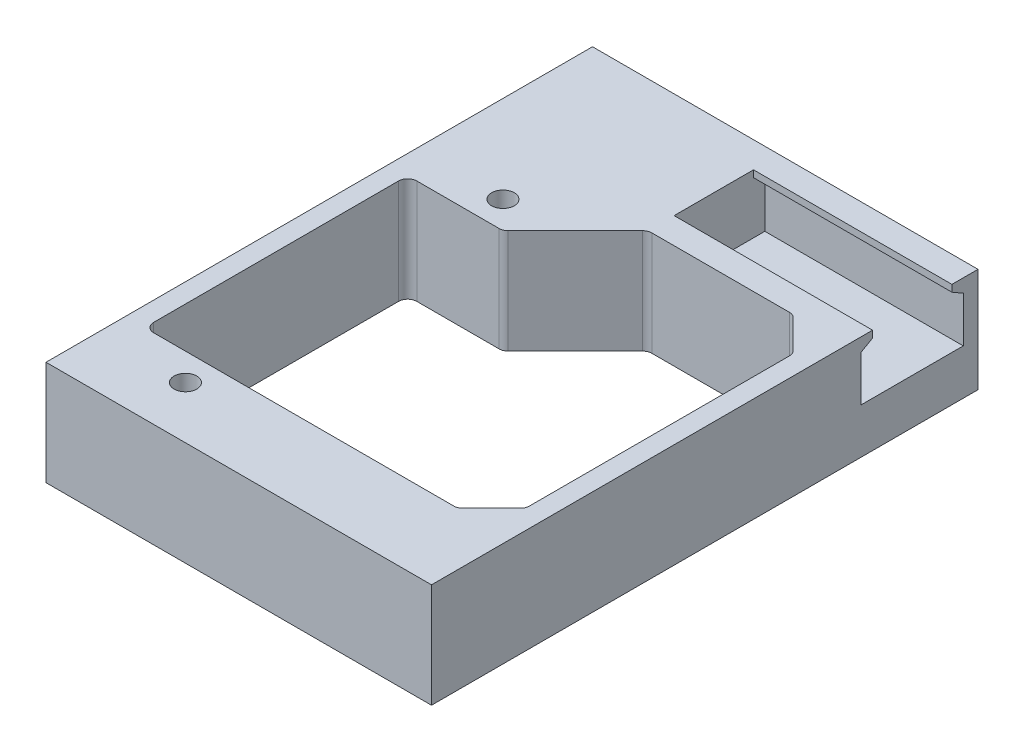
ISO-10303-21;
HEADER;
FILE_DESCRIPTION(('STEP AP214'),'2;1');
FILE_NAME('part.step','',(''),(''),'','','');
FILE_SCHEMA(('AUTOMOTIVE_DESIGN { 1 0 10303 214 1 1 1 1 }'));
ENDSEC;
DATA;
#1=APPLICATION_CONTEXT('core data for automotive mechanical design processes');
#2=APPLICATION_PROTOCOL_DEFINITION('international standard','automotive_design',2000,#1);
#3=PRODUCT_CONTEXT('',#1,'mechanical');
#4=PRODUCT('Part','Part','',(#3));
#5=PRODUCT_RELATED_PRODUCT_CATEGORY('part','',(#4));
#6=PRODUCT_DEFINITION_FORMATION('','',#4);
#7=PRODUCT_DEFINITION_CONTEXT('part definition',#1,'design');
#8=PRODUCT_DEFINITION('design','',#6,#7);
#9=PRODUCT_DEFINITION_SHAPE('','',#8);
#10=(LENGTH_UNIT() NAMED_UNIT(*) SI_UNIT(.MILLI.,.METRE.));
#11=(NAMED_UNIT(*) PLANE_ANGLE_UNIT() SI_UNIT($,.RADIAN.));
#12=(NAMED_UNIT(*) SI_UNIT($,.STERADIAN.) SOLID_ANGLE_UNIT());
#13=UNCERTAINTY_MEASURE_WITH_UNIT(LENGTH_MEASURE(1.E-05),#10,'distance_accuracy_value','');
#14=(GEOMETRIC_REPRESENTATION_CONTEXT(3) GLOBAL_UNCERTAINTY_ASSIGNED_CONTEXT((#13)) GLOBAL_UNIT_ASSIGNED_CONTEXT((#10,
#11,#12)) REPRESENTATION_CONTEXT('',''));
#15=CARTESIAN_POINT('',(0.,0.,0.));
#16=DIRECTION('',(0.,0.,1.));
#17=DIRECTION('',(1.,0.,0.));
#18=AXIS2_PLACEMENT_3D('',#15,#16,#17);
#19=CARTESIAN_POINT('',(12.3,-1.,8.5));
#20=DIRECTION('',(0.,-1.,0.));
#21=DIRECTION('',(1.,0.,0.));
#22=AXIS2_PLACEMENT_3D('',#19,#20,#21);
#23=PLANE('',#22);
#24=CARTESIAN_POINT('',(-14.,-1.,-54.3115384615385));
#25=DIRECTION('',(0.,1.,0.));
#26=DIRECTION('',(0.,0.,1.));
#27=AXIS2_PLACEMENT_3D('',#24,#25,#26);
#28=CIRCLE('',#27,1.);
#29=CARTESIAN_POINT('',(-14.,-1.,-53.3115384615385));
#30=VERTEX_POINT('',#29);
#31=EDGE_CURVE('E456',#30,#30,#28,.F.);
#32=ORIENTED_EDGE('',*,*,#31,.T.);
#33=EDGE_LOOP('',(#32));
#34=FACE_BOUND('',#33,.T.);
#35=CARTESIAN_POINT('',(-14.,-1.,-26.3115384615385));
#36=DIRECTION('',(0.,1.,0.));
#37=DIRECTION('',(0.,0.,1.));
#38=AXIS2_PLACEMENT_3D('',#35,#36,#37);
#39=CIRCLE('',#38,1.);
#40=CARTESIAN_POINT('',(-14.,-1.,-25.3115384615385));
#41=VERTEX_POINT('',#40);
#42=EDGE_CURVE('E502',#41,#41,#39,.F.);
#43=ORIENTED_EDGE('',*,*,#42,.T.);
#44=EDGE_LOOP('',(#43));
#45=FACE_BOUND('',#44,.T.);
#46=DIRECTION('',(-1.,0.,0.));
#47=VECTOR('',#46,1.);
#48=CARTESIAN_POINT('',(-21.7,-1.,-51.9115384615385));
#49=LINE('',#48,#47);
#50=CARTESIAN_POINT('',(-11.9313708498984,-1.,-51.9115384615385));
#51=VERTEX_POINT('',#50);
#52=CARTESIAN_POINT('',(-19.2,-1.,-51.9115384615385));
#53=VERTEX_POINT('',#52);
#54=EDGE_CURVE('E505',#51,#53,#49,.T.);
#55=ORIENTED_EDGE('',*,*,#54,.F.);
#56=CARTESIAN_POINT('',(-11.9313708498984,-1.,-52.7115384615385));
#57=DIRECTION('',(0.,-1.,0.));
#58=DIRECTION('',(1.,0.,0.));
#59=AXIS2_PLACEMENT_3D('',#56,#57,#58);
#60=CIRCLE('',#59,0.8);
#61=CARTESIAN_POINT('',(-11.3656854249492,-1.,-52.1458530365892));
#62=VERTEX_POINT('',#61);
#63=EDGE_CURVE('E403',#51,#62,#60,.F.);
#64=ORIENTED_EDGE('',*,*,#63,.T.);
#65=DIRECTION('',(-0.707106781186545,0.,0.70710678118655));
#66=VECTOR('',#65,1.);
#67=CARTESIAN_POINT('',(-29.8557692307693,-1.00000000000001,-33.655769230769));
#68=LINE('',#67,#66);
#69=CARTESIAN_POINT('',(-5.43431457505077,-1.,-58.0772238864877));
#70=VERTEX_POINT('',#69);
#71=EDGE_CURVE('E362',#62,#70,#68,.F.);
#72=ORIENTED_EDGE('',*,*,#71,.T.);
#73=CARTESIAN_POINT('',(-4.86862915010152,-1.,-57.5115384615385));
#74=DIRECTION('',(0.,-1.,0.));
#75=DIRECTION('',(1.,0.,0.));
#76=AXIS2_PLACEMENT_3D('',#73,#74,#75);
#77=CIRCLE('',#76,0.8);
#78=CARTESIAN_POINT('',(-4.86862915010152,-1.,-58.3115384615385));
#79=VERTEX_POINT('',#78);
#80=EDGE_CURVE('E13',#70,#79,#77,.T.);
#81=ORIENTED_EDGE('',*,*,#80,.T.);
#82=DIRECTION('',(-1.,0.,0.));
#83=VECTOR('',#82,1.);
#84=CARTESIAN_POINT('',(12.,-1.,-58.3115384615385));
#85=LINE('',#84,#83);
#86=CARTESIAN_POINT('',(7.26862915010156,-1.,-58.3115384615385));
#87=VERTEX_POINT('',#86);
#88=EDGE_CURVE('E448',#87,#79,#85,.T.);
#89=ORIENTED_EDGE('',*,*,#88,.F.);
#90=CARTESIAN_POINT('',(7.26862915010156,-1.,-57.5115384615385));
#91=DIRECTION('',(0.,-1.,0.));
#92=DIRECTION('',(1.,0.,0.));
#93=AXIS2_PLACEMENT_3D('',#90,#91,#92);
#94=CIRCLE('',#93,0.8);
#95=CARTESIAN_POINT('',(7.83431457505078,-1.,-58.0772238864877));
#96=VERTEX_POINT('',#95);
#97=EDGE_CURVE('E430',#87,#96,#94,.T.);
#98=ORIENTED_EDGE('',*,*,#97,.T.);
#99=DIRECTION('',(-0.707106781186544,0.,-0.707106781186551));
#100=VECTOR('',#99,1.);
#101=CARTESIAN_POINT('',(43.3557692307692,-0.999999999999996,-22.5557692307689));
#102=LINE('',#101,#100);
#103=CARTESIAN_POINT('',(10.3656854249492,-1.,-55.5458530365892));
#104=VERTEX_POINT('',#103);
#105=EDGE_CURVE('E359',#96,#104,#102,.F.);
#106=ORIENTED_EDGE('',*,*,#105,.T.);
#107=CARTESIAN_POINT('',(9.8,-1.,-54.98016761164));
#108=DIRECTION('',(0.,-1.,0.));
#109=DIRECTION('',(1.,0.,0.));
#110=AXIS2_PLACEMENT_3D('',#107,#108,#109);
#111=CIRCLE('',#110,0.8);
#112=CARTESIAN_POINT('',(10.6,-1.,-54.98016761164));
#113=VERTEX_POINT('',#112);
#114=EDGE_CURVE('E428',#104,#113,#111,.T.);
#115=ORIENTED_EDGE('',*,*,#114,.T.);
#116=DIRECTION('',(0.,0.,1.));
#117=VECTOR('',#116,1.);
#118=CARTESIAN_POINT('',(10.6,-1.,-28.7115384615385));
#119=LINE('',#118,#117);
#120=CARTESIAN_POINT('',(10.6,-1.,-32.042909311437));
#121=VERTEX_POINT('',#120);
#122=EDGE_CURVE('E477',#113,#121,#119,.T.);
#123=ORIENTED_EDGE('',*,*,#122,.T.);
#124=CARTESIAN_POINT('',(9.8,-1.,-32.042909311437));
#125=DIRECTION('',(0.,-1.,0.));
#126=DIRECTION('',(1.,0.,0.));
#127=AXIS2_PLACEMENT_3D('',#124,#125,#126);
#128=CIRCLE('',#127,0.8);
#129=CARTESIAN_POINT('',(10.3656854249492,-1.,-31.4772238864877));
#130=VERTEX_POINT('',#129);
#131=EDGE_CURVE('E422',#121,#130,#128,.T.);
#132=ORIENTED_EDGE('',*,*,#131,.T.);
#133=DIRECTION('',(0.707106781186543,0.,-0.707106781186552));
#134=VECTOR('',#133,1.);
#135=CARTESIAN_POINT('',(-8.65576923076926,-1.,-12.455769230769));
#136=LINE('',#135,#134);
#137=CARTESIAN_POINT('',(7.83431457505077,-1.,-28.9458530365892));
#138=VERTEX_POINT('',#137);
#139=EDGE_CURVE('E350',#130,#138,#136,.F.);
#140=ORIENTED_EDGE('',*,*,#139,.T.);
#141=CARTESIAN_POINT('',(7.26862915010153,-1.,-29.5115384615385));
#142=DIRECTION('',(0.,-1.,0.));
#143=DIRECTION('',(1.,0.,0.));
#144=AXIS2_PLACEMENT_3D('',#141,#142,#143);
#145=CIRCLE('',#144,0.8);
#146=CARTESIAN_POINT('',(7.26862915010153,-1.,-28.7115384615385));
#147=VERTEX_POINT('',#146);
#148=EDGE_CURVE('E420',#138,#147,#145,.T.);
#149=ORIENTED_EDGE('',*,*,#148,.T.);
#150=DIRECTION('',(1.,0.,0.));
#151=VECTOR('',#150,1.);
#152=CARTESIAN_POINT('',(-21.7,-1.,-28.7115384615385));
#153=LINE('',#152,#151);
#154=CARTESIAN_POINT('',(-19.2,-1.,-28.7115384615385));
#155=VERTEX_POINT('',#154);
#156=EDGE_CURVE('E309',#155,#147,#153,.T.);
#157=ORIENTED_EDGE('',*,*,#156,.F.);
#158=CARTESIAN_POINT('',(-19.2,-1.,-29.5115384615385));
#159=DIRECTION('',(0.,-1.,0.));
#160=DIRECTION('',(1.,0.,0.));
#161=AXIS2_PLACEMENT_3D('',#158,#159,#160);
#162=CIRCLE('',#161,0.8);
#163=CARTESIAN_POINT('',(-20.,-1.,-29.5115384615385));
#164=VERTEX_POINT('',#163);
#165=EDGE_CURVE('E416',#155,#164,#162,.T.);
#166=ORIENTED_EDGE('',*,*,#165,.T.);
#167=DIRECTION('',(0.,0.,1.));
#168=VECTOR('',#167,1.);
#169=CARTESIAN_POINT('',(-20.,-1.,0.));
#170=LINE('',#169,#168);
#171=CARTESIAN_POINT('',(-20.,-1.,-51.1115384615385));
#172=VERTEX_POINT('',#171);
#173=EDGE_CURVE('E452',#172,#164,#170,.T.);
#174=ORIENTED_EDGE('',*,*,#173,.F.);
#175=CARTESIAN_POINT('',(-19.2,-1.,-51.1115384615385));
#176=DIRECTION('',(0.,-1.,0.));
#177=DIRECTION('',(1.,0.,0.));
#178=AXIS2_PLACEMENT_3D('',#175,#176,#177);
#179=CIRCLE('',#178,0.8);
#180=EDGE_CURVE('E410',#172,#53,#179,.T.);
#181=ORIENTED_EDGE('',*,*,#180,.T.);
#182=EDGE_LOOP('',(#55,#64,#72,#81,#89,#98,#106,#115,#123,#132,#140,#149,#157,#166,#174,#181));
#183=FACE_BOUND('',#182,.T.);
#184=DIRECTION('',(0.,0.,-1.));
#185=VECTOR('',#184,1.);
#186=CARTESIAN_POINT('',(-21.7,-1.,8.5));
#187=LINE('',#186,#185);
#188=CARTESIAN_POINT('',(-21.7,-1.,-21.7115384615385));
#189=VERTEX_POINT('',#188);
#190=CARTESIAN_POINT('',(-21.7,-1.,-69.9115384615385));
#191=VERTEX_POINT('',#190);
#192=EDGE_CURVE('E314',#189,#191,#187,.T.);
#193=ORIENTED_EDGE('',*,*,#192,.F.);
#194=DIRECTION('',(-1.,0.,0.));
#195=VECTOR('',#194,1.);
#196=CARTESIAN_POINT('',(-21.7,-1.,-21.7115384615385));
#197=LINE('',#196,#195);
#198=CARTESIAN_POINT('',(12.3,-1.,-21.7115384615385));
#199=VERTEX_POINT('',#198);
#200=EDGE_CURVE('E299',#199,#189,#197,.T.);
#201=ORIENTED_EDGE('',*,*,#200,.F.);
#202=DIRECTION('',(0.,0.,-1.));
#203=VECTOR('',#202,1.);
#204=CARTESIAN_POINT('',(12.3,-1.,-21.7115384615385));
#205=LINE('',#204,#203);
#206=CARTESIAN_POINT('',(12.3,-1.,-60.6115384615385));
#207=VERTEX_POINT('',#206);
#208=EDGE_CURVE('E499',#199,#207,#205,.T.);
#209=ORIENTED_EDGE('',*,*,#208,.T.);
#210=DIRECTION('',(1.,0.,0.));
#211=VECTOR('',#210,1.);
#212=CARTESIAN_POINT('',(-5.20000000000001,-1.,-60.6115384615385));
#213=LINE('',#212,#211);
#214=CARTESIAN_POINT('',(-5.20000000000001,-1.,-60.6115384615385));
#215=VERTEX_POINT('',#214);
#216=EDGE_CURVE('E483',#215,#207,#213,.T.);
#217=ORIENTED_EDGE('',*,*,#216,.F.);
#218=DIRECTION('',(0.,0.,1.));
#219=VECTOR('',#218,1.);
#220=CARTESIAN_POINT('',(-5.20000000000001,-1.,0.));
#221=LINE('',#220,#219);
#222=CARTESIAN_POINT('',(-5.20000000000001,-1.,-67.6115384615385));
#223=VERTEX_POINT('',#222);
#224=EDGE_CURVE('E922',#223,#215,#221,.T.);
#225=ORIENTED_EDGE('',*,*,#224,.F.);
#226=DIRECTION('',(1.,0.,0.));
#227=VECTOR('',#226,1.);
#228=CARTESIAN_POINT('',(-5.20000000000001,-1.,-67.6115384615385));
#229=LINE('',#228,#227);
#230=CARTESIAN_POINT('',(12.3,-1.,-67.6115384615385));
#231=VERTEX_POINT('',#230);
#232=EDGE_CURVE('E954',#223,#231,#229,.T.);
#233=ORIENTED_EDGE('',*,*,#232,.T.);
#234=CARTESIAN_POINT('',(12.3,-1.,-69.9115384615385));
#235=VERTEX_POINT('',#234);
#236=EDGE_CURVE('E498',#231,#235,#205,.T.);
#237=ORIENTED_EDGE('',*,*,#236,.T.);
#238=DIRECTION('',(-1.,0.,0.));
#239=VECTOR('',#238,1.);
#240=CARTESIAN_POINT('',(0.,-1.,-69.9115384615385));
#241=LINE('',#240,#239);
#242=EDGE_CURVE('E320',#235,#191,#241,.T.);
#243=ORIENTED_EDGE('',*,*,#242,.T.);
#244=EDGE_LOOP('',(#193,#201,#209,#217,#225,#233,#237,#243));
#245=FACE_BOUND('',#244,.T.);
#246=ADVANCED_FACE('F113',(#34,#45,#183,#245),#23,.F.);
#247=CARTESIAN_POINT('',(12.3,-1.,8.5));
#248=DIRECTION('',(-1.,0.,0.));
#249=DIRECTION('',(0.,-1.,0.));
#250=AXIS2_PLACEMENT_3D('',#247,#248,#249);
#251=PLANE('',#250);
#252=ORIENTED_EDGE('',*,*,#208,.F.);
#253=DIRECTION('',(0.,1.,0.));
#254=VECTOR('',#253,1.);
#255=CARTESIAN_POINT('',(12.3,-32.3896201004171,-21.7115384615385));
#256=LINE('',#255,#254);
#257=CARTESIAN_POINT('',(12.3,-10.2,-21.7115384615385));
#258=VERTEX_POINT('',#257);
#259=EDGE_CURVE('E305',#258,#199,#256,.T.);
#260=ORIENTED_EDGE('',*,*,#259,.F.);
#261=DIRECTION('',(0.,0.,1.));
#262=VECTOR('',#261,1.);
#263=CARTESIAN_POINT('',(12.3,-10.2,-21.7115384615385));
#264=LINE('',#263,#262);
#265=CARTESIAN_POINT('',(12.3,-10.2,-69.9115384615385));
#266=VERTEX_POINT('',#265);
#267=EDGE_CURVE('E323',#266,#258,#264,.T.);
#268=ORIENTED_EDGE('',*,*,#267,.F.);
#269=DIRECTION('',(0.,1.,0.));
#270=VECTOR('',#269,1.);
#271=CARTESIAN_POINT('',(12.3,-51.4350578998017,-69.9115384615385));
#272=LINE('',#271,#270);
#273=EDGE_CURVE('E475',#266,#235,#272,.T.);
#274=ORIENTED_EDGE('',*,*,#273,.T.);
#275=ORIENTED_EDGE('',*,*,#236,.F.);
#276=DIRECTION('',(0.,-1.,0.));
#277=VECTOR('',#276,1.);
#278=CARTESIAN_POINT('',(12.3,0.,-67.6115384615385));
#279=LINE('',#278,#277);
#280=CARTESIAN_POINT('',(12.3,-1.59999999999999,-67.6115384615385));
#281=VERTEX_POINT('',#280);
#282=EDGE_CURVE('E926',#231,#281,#279,.T.);
#283=ORIENTED_EDGE('',*,*,#282,.T.);
#284=DIRECTION('',(0.,0.499999999999999,0.866025403784439));
#285=VECTOR('',#284,1.);
#286=CARTESIAN_POINT('',(12.3,-1.59999999999999,-67.6115384615385));
#287=LINE('',#286,#285);
#288=CARTESIAN_POINT('',(12.3,-2.17735026918962,-68.6115384615385));
#289=VERTEX_POINT('',#288);
#290=EDGE_CURVE('E333',#281,#289,#287,.F.);
#291=ORIENTED_EDGE('',*,*,#290,.T.);
#292=DIRECTION('',(0.,-1.,0.));
#293=VECTOR('',#292,1.);
#294=CARTESIAN_POINT('',(12.3,-2.38044092984233E-13,-68.6115384615385));
#295=LINE('',#294,#293);
#296=CARTESIAN_POINT('',(12.3,-6.2,-68.6115384615384));
#297=VERTEX_POINT('',#296);
#298=EDGE_CURVE('E931',#289,#297,#295,.T.);
#299=ORIENTED_EDGE('',*,*,#298,.T.);
#300=DIRECTION('',(0.,0.,-1.));
#301=VECTOR('',#300,1.);
#302=CARTESIAN_POINT('',(12.3,-6.2,0.));
#303=LINE('',#302,#301);
#304=CARTESIAN_POINT('',(12.3,-6.2,-59.6115384615385));
#305=VERTEX_POINT('',#304);
#306=EDGE_CURVE('E948',#305,#297,#303,.T.);
#307=ORIENTED_EDGE('',*,*,#306,.F.);
#308=DIRECTION('',(0.,-1.,0.));
#309=VECTOR('',#308,1.);
#310=CARTESIAN_POINT('',(12.3,0.,-59.6115384615385));
#311=LINE('',#310,#309);
#312=CARTESIAN_POINT('',(12.3,-2.17735026918961,-59.6115384615385));
#313=VERTEX_POINT('',#312);
#314=EDGE_CURVE('E945',#313,#305,#311,.T.);
#315=ORIENTED_EDGE('',*,*,#314,.F.);
#316=DIRECTION('',(0.,0.499999999999997,-0.866025403784441));
#317=VECTOR('',#316,1.);
#318=CARTESIAN_POINT('',(12.3,-2.2,-59.5723079769971));
#319=LINE('',#318,#317);
#320=CARTESIAN_POINT('',(12.3,-1.59999999999999,-60.6115384615385));
#321=VERTEX_POINT('',#320);
#322=EDGE_CURVE('E326',#313,#321,#319,.T.);
#323=ORIENTED_EDGE('',*,*,#322,.T.);
#324=DIRECTION('',(0.,1.,0.));
#325=VECTOR('',#324,1.);
#326=CARTESIAN_POINT('',(12.3,0.,-60.6115384615385));
#327=LINE('',#326,#325);
#328=EDGE_CURVE('E317',#321,#207,#327,.T.);
#329=ORIENTED_EDGE('',*,*,#328,.T.);
#330=EDGE_LOOP('',(#252,#260,#268,#274,#275,#283,#291,#299,#307,#315,#323,#329));
#331=FACE_BOUND('',#330,.T.);
#332=ADVANCED_FACE('F473',(#331),#251,.F.);
#333=CARTESIAN_POINT('',(-21.7,-1.,8.5));
#334=DIRECTION('',(1.,0.,0.));
#335=DIRECTION('',(0.,1.,0.));
#336=AXIS2_PLACEMENT_3D('',#333,#334,#335);
#337=PLANE('',#336);
#338=DIRECTION('',(0.,0.,1.));
#339=VECTOR('',#338,1.);
#340=CARTESIAN_POINT('',(-21.7,-10.2,0.));
#341=LINE('',#340,#339);
#342=CARTESIAN_POINT('',(-21.7,-10.2,-69.9115384615385));
#343=VERTEX_POINT('',#342);
#344=CARTESIAN_POINT('',(-21.7,-10.2,-21.7115384615385));
#345=VERTEX_POINT('',#344);
#346=EDGE_CURVE('E316',#343,#345,#341,.T.);
#347=ORIENTED_EDGE('',*,*,#346,.T.);
#348=DIRECTION('',(0.,1.,0.));
#349=VECTOR('',#348,1.);
#350=CARTESIAN_POINT('',(-21.7,-39.,-21.7115384615385));
#351=LINE('',#350,#349);
#352=EDGE_CURVE('E302',#345,#189,#351,.T.);
#353=ORIENTED_EDGE('',*,*,#352,.T.);
#354=ORIENTED_EDGE('',*,*,#192,.T.);
#355=DIRECTION('',(0.,1.,0.));
#356=VECTOR('',#355,1.);
#357=CARTESIAN_POINT('',(-21.7,-10.2,-69.9115384615385));
#358=LINE('',#357,#356);
#359=EDGE_CURVE('E328',#343,#191,#358,.T.);
#360=ORIENTED_EDGE('',*,*,#359,.F.);
#361=EDGE_LOOP('',(#347,#353,#354,#360));
#362=FACE_BOUND('',#361,.T.);
#363=ADVANCED_FACE('F312',(#362),#337,.F.);
#364=CARTESIAN_POINT('',(-20.,-10.2,0.));
#365=DIRECTION('',(-1.,0.,0.));
#366=DIRECTION('',(0.,0.,1.));
#367=AXIS2_PLACEMENT_3D('',#364,#365,#366);
#368=PLANE('',#367);
#369=DIRECTION('',(0.,0.,1.));
#370=VECTOR('',#369,1.);
#371=CARTESIAN_POINT('',(-20.,-10.2,0.));
#372=LINE('',#371,#370);
#373=CARTESIAN_POINT('',(-20.,-10.2,-51.1115384615385));
#374=VERTEX_POINT('',#373);
#375=CARTESIAN_POINT('',(-20.,-10.2,-29.5115384615385));
#376=VERTEX_POINT('',#375);
#377=EDGE_CURVE('E460',#374,#376,#372,.T.);
#378=ORIENTED_EDGE('',*,*,#377,.F.);
#379=DIRECTION('',(0.,1.,0.));
#380=VECTOR('',#379,1.);
#381=CARTESIAN_POINT('',(-20.,-10.2,-51.1115384615385));
#382=LINE('',#381,#380);
#383=EDGE_CURVE('E370',#374,#172,#382,.T.);
#384=ORIENTED_EDGE('',*,*,#383,.T.);
#385=ORIENTED_EDGE('',*,*,#173,.T.);
#386=DIRECTION('',(0.,-1.,0.));
#387=VECTOR('',#386,1.);
#388=CARTESIAN_POINT('',(-20.,-10.2,-29.5115384615385));
#389=LINE('',#388,#387);
#390=EDGE_CURVE('E367',#164,#376,#389,.T.);
#391=ORIENTED_EDGE('',*,*,#390,.T.);
#392=EDGE_LOOP('',(#378,#384,#385,#391));
#393=FACE_BOUND('',#392,.T.);
#394=ADVANCED_FACE('F521',(#393),#368,.F.);
#395=CARTESIAN_POINT('',(0.,-10.2,-69.9115384615385));
#396=DIRECTION('',(0.,0.,-1.));
#397=DIRECTION('',(-1.,0.,0.));
#398=AXIS2_PLACEMENT_3D('',#395,#396,#397);
#399=PLANE('',#398);
#400=ORIENTED_EDGE('',*,*,#359,.T.);
#401=ORIENTED_EDGE('',*,*,#242,.F.);
#402=ORIENTED_EDGE('',*,*,#273,.F.);
#403=DIRECTION('',(-1.,0.,0.));
#404=VECTOR('',#403,1.);
#405=CARTESIAN_POINT('',(0.,-10.2,-69.9115384615385));
#406=LINE('',#405,#404);
#407=EDGE_CURVE('E463',#266,#343,#406,.T.);
#408=ORIENTED_EDGE('',*,*,#407,.T.);
#409=EDGE_LOOP('',(#400,#401,#402,#408));
#410=FACE_BOUND('',#409,.T.);
#411=ADVANCED_FACE('F467',(#410),#399,.T.);
#412=CARTESIAN_POINT('',(0.,-10.2,0.));
#413=DIRECTION('',(0.,1.,0.));
#414=DIRECTION('',(0.,0.,1.));
#415=AXIS2_PLACEMENT_3D('',#412,#413,#414);
#416=PLANE('',#415);
#417=DIRECTION('',(0.707106781186545,0.,-0.70710678118655));
#418=VECTOR('',#417,1.);
#419=CARTESIAN_POINT('',(-31.7557692307692,-10.2,-31.755769230769));
#420=LINE('',#419,#418);
#421=CARTESIAN_POINT('',(-5.43431457505076,-10.2,-58.0772238864877));
#422=VERTEX_POINT('',#421);
#423=CARTESIAN_POINT('',(-11.3656854249492,-10.2,-52.1458530365892));
#424=VERTEX_POINT('',#423);
#425=EDGE_CURVE('E365',#422,#424,#420,.F.);
#426=ORIENTED_EDGE('',*,*,#425,.T.);
#427=CARTESIAN_POINT('',(-11.9313708498984,-10.2,-52.7115384615385));
#428=DIRECTION('',(0.,1.,0.));
#429=DIRECTION('',(0.,0.,1.));
#430=AXIS2_PLACEMENT_3D('',#427,#428,#429);
#431=CIRCLE('',#430,0.8);
#432=CARTESIAN_POINT('',(-11.9313708498984,-10.2,-51.9115384615385));
#433=VERTEX_POINT('',#432);
#434=EDGE_CURVE('E408',#424,#433,#431,.F.);
#435=ORIENTED_EDGE('',*,*,#434,.T.);
#436=DIRECTION('',(-1.,0.,0.));
#437=VECTOR('',#436,1.);
#438=CARTESIAN_POINT('',(-21.7,-10.2,-51.9115384615385));
#439=LINE('',#438,#437);
#440=CARTESIAN_POINT('',(-19.2,-10.2,-51.9115384615385));
#441=VERTEX_POINT('',#440);
#442=EDGE_CURVE('E495',#433,#441,#439,.T.);
#443=ORIENTED_EDGE('',*,*,#442,.T.);
#444=CARTESIAN_POINT('',(-19.2,-10.2,-51.1115384615385));
#445=DIRECTION('',(0.,1.,0.));
#446=DIRECTION('',(0.,0.,1.));
#447=AXIS2_PLACEMENT_3D('',#444,#445,#446);
#448=CIRCLE('',#447,0.8);
#449=EDGE_CURVE('E412',#441,#374,#448,.T.);
#450=ORIENTED_EDGE('',*,*,#449,.T.);
#451=ORIENTED_EDGE('',*,*,#377,.T.);
#452=CARTESIAN_POINT('',(-19.2,-10.2,-29.5115384615385));
#453=DIRECTION('',(0.,1.,0.));
#454=DIRECTION('',(0.,0.,1.));
#455=AXIS2_PLACEMENT_3D('',#452,#453,#454);
#456=CIRCLE('',#455,0.8);
#457=CARTESIAN_POINT('',(-19.2,-10.2,-28.7115384615385));
#458=VERTEX_POINT('',#457);
#459=EDGE_CURVE('E414',#376,#458,#456,.T.);
#460=ORIENTED_EDGE('',*,*,#459,.T.);
#461=DIRECTION('',(1.,0.,0.));
#462=VECTOR('',#461,1.);
#463=CARTESIAN_POINT('',(-21.7,-10.2,-28.7115384615385));
#464=LINE('',#463,#462);
#465=CARTESIAN_POINT('',(7.26862915010153,-10.2,-28.7115384615385));
#466=VERTEX_POINT('',#465);
#467=EDGE_CURVE('E480',#458,#466,#464,.T.);
#468=ORIENTED_EDGE('',*,*,#467,.T.);
#469=CARTESIAN_POINT('',(7.26862915010153,-10.2,-29.5115384615385));
#470=DIRECTION('',(0.,1.,0.));
#471=DIRECTION('',(0.,0.,1.));
#472=AXIS2_PLACEMENT_3D('',#469,#470,#471);
#473=CIRCLE('',#472,0.8);
#474=CARTESIAN_POINT('',(7.83431457505078,-10.2,-28.9458530365892));
#475=VERTEX_POINT('',#474);
#476=EDGE_CURVE('E418',#466,#475,#473,.T.);
#477=ORIENTED_EDGE('',*,*,#476,.T.);
#478=DIRECTION('',(-0.707106781186543,0.,0.707106781186552));
#479=VECTOR('',#478,1.);
#480=CARTESIAN_POINT('',(-10.5557692307692,-10.2,-10.555769230769));
#481=LINE('',#480,#479);
#482=CARTESIAN_POINT('',(10.3656854249492,-10.2,-31.4772238864877));
#483=VERTEX_POINT('',#482);
#484=EDGE_CURVE('E353',#475,#483,#481,.F.);
#485=ORIENTED_EDGE('',*,*,#484,.T.);
#486=CARTESIAN_POINT('',(9.8,-10.2,-32.042909311437));
#487=DIRECTION('',(0.,1.,0.));
#488=DIRECTION('',(0.,0.,1.));
#489=AXIS2_PLACEMENT_3D('',#486,#487,#488);
#490=CIRCLE('',#489,0.8);
#491=CARTESIAN_POINT('',(10.6,-10.2,-32.042909311437));
#492=VERTEX_POINT('',#491);
#493=EDGE_CURVE('E424',#483,#492,#490,.T.);
#494=ORIENTED_EDGE('',*,*,#493,.T.);
#495=DIRECTION('',(0.,0.,-1.));
#496=VECTOR('',#495,1.);
#497=CARTESIAN_POINT('',(10.6,-10.2,-28.7115384615385));
#498=LINE('',#497,#496);
#499=CARTESIAN_POINT('',(10.6,-10.2,-54.98016761164));
#500=VERTEX_POINT('',#499);
#501=EDGE_CURVE('E476',#492,#500,#498,.T.);
#502=ORIENTED_EDGE('',*,*,#501,.T.);
#503=CARTESIAN_POINT('',(9.8,-10.2,-54.98016761164));
#504=DIRECTION('',(0.,1.,0.));
#505=DIRECTION('',(0.,0.,1.));
#506=AXIS2_PLACEMENT_3D('',#503,#504,#505);
#507=CIRCLE('',#506,0.8);
#508=CARTESIAN_POINT('',(10.3656854249492,-10.2,-55.5458530365892));
#509=VERTEX_POINT('',#508);
#510=EDGE_CURVE('E426',#500,#509,#507,.T.);
#511=ORIENTED_EDGE('',*,*,#510,.T.);
#512=DIRECTION('',(0.707106781186544,0.,0.707106781186551));
#513=VECTOR('',#512,1.);
#514=CARTESIAN_POINT('',(32.9557692307693,-10.2,-32.955769230769));
#515=LINE('',#514,#513);
#516=CARTESIAN_POINT('',(7.83431457505079,-10.2,-58.0772238864877));
#517=VERTEX_POINT('',#516);
#518=EDGE_CURVE('E356',#509,#517,#515,.F.);
#519=ORIENTED_EDGE('',*,*,#518,.T.);
#520=CARTESIAN_POINT('',(7.26862915010156,-10.2,-57.5115384615385));
#521=DIRECTION('',(0.,1.,0.));
#522=DIRECTION('',(0.,0.,1.));
#523=AXIS2_PLACEMENT_3D('',#520,#521,#522);
#524=CIRCLE('',#523,0.8);
#525=CARTESIAN_POINT('',(7.26862915010156,-10.2,-58.3115384615385));
#526=VERTEX_POINT('',#525);
#527=EDGE_CURVE('E432',#517,#526,#524,.T.);
#528=ORIENTED_EDGE('',*,*,#527,.T.);
#529=DIRECTION('',(-1.,0.,0.));
#530=VECTOR('',#529,1.);
#531=CARTESIAN_POINT('',(12.,-10.2,-58.3115384615385));
#532=LINE('',#531,#530);
#533=CARTESIAN_POINT('',(-4.86862915010152,-10.2,-58.3115384615385));
#534=VERTEX_POINT('',#533);
#535=EDGE_CURVE('E438',#526,#534,#532,.T.);
#536=ORIENTED_EDGE('',*,*,#535,.T.);
#537=CARTESIAN_POINT('',(-4.86862915010152,-10.2,-57.5115384615385));
#538=DIRECTION('',(0.,1.,0.));
#539=DIRECTION('',(0.,0.,1.));
#540=AXIS2_PLACEMENT_3D('',#537,#538,#539);
#541=CIRCLE('',#540,0.8);
#542=EDGE_CURVE('E121',#534,#422,#541,.T.);
#543=ORIENTED_EDGE('',*,*,#542,.T.);
#544=EDGE_LOOP('',(#426,#435,#443,#450,#451,#460,#468,#477,#485,#494,#502,#511,#519,#528,#536,#543));
#545=FACE_BOUND('',#544,.T.);
#546=DIRECTION('',(-1.,0.,0.));
#547=VECTOR('',#546,1.);
#548=CARTESIAN_POINT('',(-21.7,-10.2,-21.7115384615385));
#549=LINE('',#548,#547);
#550=EDGE_CURVE('E128',#258,#345,#549,.T.);
#551=ORIENTED_EDGE('',*,*,#550,.T.);
#552=ORIENTED_EDGE('',*,*,#346,.F.);
#553=ORIENTED_EDGE('',*,*,#407,.F.);
#554=ORIENTED_EDGE('',*,*,#267,.T.);
#555=EDGE_LOOP('',(#551,#552,#553,#554));
#556=FACE_BOUND('',#555,.T.);
#557=CARTESIAN_POINT('',(-14.,-10.2,-54.3115384615385));
#558=DIRECTION('',(0.,1.,0.));
#559=DIRECTION('',(-1.,0.,0.));
#560=AXIS2_PLACEMENT_3D('',#557,#558,#559);
#561=CIRCLE('',#560,1.);
#562=CARTESIAN_POINT('',(-15.,-10.2,-54.3115384615385));
#563=VERTEX_POINT('',#562);
#564=EDGE_CURVE('E492',#563,#563,#561,.F.);
#565=ORIENTED_EDGE('',*,*,#564,.F.);
#566=EDGE_LOOP('',(#565));
#567=FACE_BOUND('',#566,.T.);
#568=CARTESIAN_POINT('',(-14.,-10.2,-26.3115384615385));
#569=DIRECTION('',(0.,1.,0.));
#570=DIRECTION('',(-1.,0.,0.));
#571=AXIS2_PLACEMENT_3D('',#568,#569,#570);
#572=CIRCLE('',#571,1.);
#573=CARTESIAN_POINT('',(-15.,-10.2,-26.3115384615385));
#574=VERTEX_POINT('',#573);
#575=EDGE_CURVE('E489',#574,#574,#572,.F.);
#576=ORIENTED_EDGE('',*,*,#575,.F.);
#577=EDGE_LOOP('',(#576));
#578=FACE_BOUND('',#577,.T.);
#579=ADVANCED_FACE('F435',(#545,#556,#567,#578),#416,.F.);
#580=CARTESIAN_POINT('',(12.,34.6405667743935,-58.3115384615385));
#581=DIRECTION('',(0.,0.,1.));
#582=DIRECTION('',(1.,0.,0.));
#583=AXIS2_PLACEMENT_3D('',#580,#581,#582);
#584=PLANE('',#583);
#585=ORIENTED_EDGE('',*,*,#535,.F.);
#586=DIRECTION('',(0.,-1.,0.));
#587=VECTOR('',#586,1.);
#588=CARTESIAN_POINT('',(7.26862915010156,34.6405667743935,-58.3115384615385));
#589=LINE('',#588,#587);
#590=EDGE_CURVE('E400',#526,#87,#589,.F.);
#591=ORIENTED_EDGE('',*,*,#590,.T.);
#592=ORIENTED_EDGE('',*,*,#88,.T.);
#593=DIRECTION('',(0.,1.,0.));
#594=VECTOR('',#593,1.);
#595=CARTESIAN_POINT('',(-4.86862915010152,34.6405667743935,-58.3115384615385));
#596=LINE('',#595,#594);
#597=EDGE_CURVE('E397',#79,#534,#596,.F.);
#598=ORIENTED_EDGE('',*,*,#597,.T.);
#599=EDGE_LOOP('',(#585,#591,#592,#598));
#600=FACE_BOUND('',#599,.T.);
#601=ADVANCED_FACE('F450',(#600),#584,.T.);
#602=CARTESIAN_POINT('',(-21.7,15.6524758424985,-51.9115384615385));
#603=DIRECTION('',(0.,0.,1.));
#604=DIRECTION('',(1.,0.,0.));
#605=AXIS2_PLACEMENT_3D('',#602,#603,#604);
#606=PLANE('',#605);
#607=ORIENTED_EDGE('',*,*,#54,.T.);
#608=DIRECTION('',(0.,1.,0.));
#609=VECTOR('',#608,1.);
#610=CARTESIAN_POINT('',(-19.2,15.6524758424985,-51.9115384615385));
#611=LINE('',#610,#609);
#612=EDGE_CURVE('E376',#53,#441,#611,.F.);
#613=ORIENTED_EDGE('',*,*,#612,.T.);
#614=ORIENTED_EDGE('',*,*,#442,.F.);
#615=DIRECTION('',(0.,-1.,0.));
#616=VECTOR('',#615,1.);
#617=CARTESIAN_POINT('',(-11.9313708498984,-1.,-51.9115384615385));
#618=LINE('',#617,#616);
#619=EDGE_CURVE('E373',#433,#51,#618,.F.);
#620=ORIENTED_EDGE('',*,*,#619,.T.);
#621=EDGE_LOOP('',(#607,#613,#614,#620));
#622=FACE_BOUND('',#621,.T.);
#623=ADVANCED_FACE('F512',(#622),#606,.T.);
#624=CARTESIAN_POINT('',(-14.,15.6524758424985,-54.3115384615385));
#625=DIRECTION('',(0.,-1.,0.));
#626=DIRECTION('',(0.,0.,-1.));
#627=AXIS2_PLACEMENT_3D('',#624,#625,#626);
#628=CYLINDRICAL_SURFACE('',#627,1.);
#629=ORIENTED_EDGE('',*,*,#564,.T.);
#630=EDGE_LOOP('',(#629));
#631=FACE_BOUND('',#630,.T.);
#632=ORIENTED_EDGE('',*,*,#31,.F.);
#633=EDGE_LOOP('',(#632));
#634=FACE_BOUND('',#633,.T.);
#635=ADVANCED_FACE('F689',(#631,#634),#628,.F.);
#636=CARTESIAN_POINT('',(-21.7,15.6524758424985,-21.7115384615385));
#637=DIRECTION('',(0.,0.,1.));
#638=DIRECTION('',(1.,0.,0.));
#639=AXIS2_PLACEMENT_3D('',#636,#637,#638);
#640=PLANE('',#639);
#641=ORIENTED_EDGE('',*,*,#259,.T.);
#642=ORIENTED_EDGE('',*,*,#200,.T.);
#643=ORIENTED_EDGE('',*,*,#352,.F.);
#644=ORIENTED_EDGE('',*,*,#550,.F.);
#645=EDGE_LOOP('',(#641,#642,#643,#644));
#646=FACE_BOUND('',#645,.T.);
#647=ADVANCED_FACE('F301',(#646),#640,.T.);
#648=CARTESIAN_POINT('',(-21.7,15.6524758424985,-28.7115384615385));
#649=DIRECTION('',(0.,0.,-1.));
#650=DIRECTION('',(-1.,0.,0.));
#651=AXIS2_PLACEMENT_3D('',#648,#649,#650);
#652=PLANE('',#651);
#653=ORIENTED_EDGE('',*,*,#467,.F.);
#654=DIRECTION('',(0.,-1.,0.));
#655=VECTOR('',#654,1.);
#656=CARTESIAN_POINT('',(-19.2,15.6524758424985,-28.7115384615385));
#657=LINE('',#656,#655);
#658=EDGE_CURVE('E381',#458,#155,#657,.F.);
#659=ORIENTED_EDGE('',*,*,#658,.T.);
#660=ORIENTED_EDGE('',*,*,#156,.T.);
#661=DIRECTION('',(0.,1.,0.));
#662=VECTOR('',#661,1.);
#663=CARTESIAN_POINT('',(7.26862915010153,15.6524758424985,-28.7115384615385));
#664=LINE('',#663,#662);
#665=EDGE_CURVE('E378',#147,#466,#664,.F.);
#666=ORIENTED_EDGE('',*,*,#665,.T.);
#667=EDGE_LOOP('',(#653,#659,#660,#666));
#668=FACE_BOUND('',#667,.T.);
#669=ADVANCED_FACE('F530',(#668),#652,.T.);
#670=CARTESIAN_POINT('',(-14.,15.6524758424985,-26.3115384615385));
#671=DIRECTION('',(0.,-1.,0.));
#672=DIRECTION('',(0.,0.,-1.));
#673=AXIS2_PLACEMENT_3D('',#670,#671,#672);
#674=CYLINDRICAL_SURFACE('',#673,1.);
#675=ORIENTED_EDGE('',*,*,#575,.T.);
#676=EDGE_LOOP('',(#675));
#677=FACE_BOUND('',#676,.T.);
#678=ORIENTED_EDGE('',*,*,#42,.F.);
#679=EDGE_LOOP('',(#678));
#680=FACE_BOUND('',#679,.T.);
#681=ADVANCED_FACE('F703',(#677,#680),#674,.F.);
#682=CARTESIAN_POINT('',(10.6,-51.4350578998017,-28.7115384615385));
#683=DIRECTION('',(-1.,0.,0.));
#684=DIRECTION('',(0.,0.,1.));
#685=AXIS2_PLACEMENT_3D('',#682,#683,#684);
#686=PLANE('',#685);
#687=ORIENTED_EDGE('',*,*,#501,.F.);
#688=DIRECTION('',(0.,-1.,0.));
#689=VECTOR('',#688,1.);
#690=CARTESIAN_POINT('',(10.6,-51.4350578998017,-32.042909311437));
#691=LINE('',#690,#689);
#692=EDGE_CURVE('E390',#492,#121,#691,.F.);
#693=ORIENTED_EDGE('',*,*,#692,.T.);
#694=ORIENTED_EDGE('',*,*,#122,.F.);
#695=DIRECTION('',(0.,1.,0.));
#696=VECTOR('',#695,1.);
#697=CARTESIAN_POINT('',(10.6,-51.4350578998017,-54.98016761164));
#698=LINE('',#697,#696);
#699=EDGE_CURVE('E387',#113,#500,#698,.F.);
#700=ORIENTED_EDGE('',*,*,#699,.T.);
#701=EDGE_LOOP('',(#687,#693,#694,#700));
#702=FACE_BOUND('',#701,.T.);
#703=ADVANCED_FACE('F548',(#702),#686,.T.);
#704=CARTESIAN_POINT('',(-5.20000000000001,0.,-60.6115384615385));
#705=DIRECTION('',(0.,0.,-1.));
#706=DIRECTION('',(-1.,0.,0.));
#707=AXIS2_PLACEMENT_3D('',#704,#705,#706);
#708=PLANE('',#707);
#709=ORIENTED_EDGE('',*,*,#328,.F.);
#710=DIRECTION('',(-1.,0.,0.));
#711=VECTOR('',#710,1.);
#712=CARTESIAN_POINT('',(-5.20000000000001,-1.59999999999999,-60.6115384615385));
#713=LINE('',#712,#711);
#714=CARTESIAN_POINT('',(-5.20000000000001,-1.59999999999999,-60.6115384615385));
#715=VERTEX_POINT('',#714);
#716=EDGE_CURVE('E336',#321,#715,#713,.T.);
#717=ORIENTED_EDGE('',*,*,#716,.T.);
#718=DIRECTION('',(0.,1.,0.));
#719=VECTOR('',#718,1.);
#720=CARTESIAN_POINT('',(-5.20000000000001,0.,-60.6115384615385));
#721=LINE('',#720,#719);
#722=EDGE_CURVE('E917',#715,#215,#721,.T.);
#723=ORIENTED_EDGE('',*,*,#722,.T.);
#724=ORIENTED_EDGE('',*,*,#216,.T.);
#725=EDGE_LOOP('',(#709,#717,#723,#724));
#726=FACE_BOUND('',#725,.T.);
#727=ADVANCED_FACE('F719',(#726),#708,.T.);
#728=CARTESIAN_POINT('',(-5.20000000000001,0.,-67.6115384615385));
#729=DIRECTION('',(0.,0.,1.));
#730=DIRECTION('',(1.,0.,0.));
#731=AXIS2_PLACEMENT_3D('',#728,#729,#730);
#732=PLANE('',#731);
#733=DIRECTION('',(0.,-1.,0.));
#734=VECTOR('',#733,1.);
#735=CARTESIAN_POINT('',(-5.20000000000001,0.,-67.6115384615385));
#736=LINE('',#735,#734);
#737=CARTESIAN_POINT('',(-5.20000000000001,-1.59999999999999,-67.6115384615385));
#738=VERTEX_POINT('',#737);
#739=EDGE_CURVE('E938',#223,#738,#736,.T.);
#740=ORIENTED_EDGE('',*,*,#739,.T.);
#741=DIRECTION('',(1.,0.,0.));
#742=VECTOR('',#741,1.);
#743=CARTESIAN_POINT('',(-5.20000000000001,-1.59999999999999,-67.6115384615385));
#744=LINE('',#743,#742);
#745=EDGE_CURVE('E322',#738,#281,#744,.T.);
#746=ORIENTED_EDGE('',*,*,#745,.T.);
#747=ORIENTED_EDGE('',*,*,#282,.F.);
#748=ORIENTED_EDGE('',*,*,#232,.F.);
#749=EDGE_LOOP('',(#740,#746,#747,#748));
#750=FACE_BOUND('',#749,.T.);
#751=ADVANCED_FACE('F726',(#750),#732,.T.);
#752=CARTESIAN_POINT('',(-5.20000000000001,-2.38044092984233E-13,-68.6115384615385));
#753=DIRECTION('',(0.,0.,1.));
#754=DIRECTION('',(0.,-1.,0.));
#755=AXIS2_PLACEMENT_3D('',#752,#753,#754);
#756=PLANE('',#755);
#757=ORIENTED_EDGE('',*,*,#298,.F.);
#758=DIRECTION('',(1.,0.,0.));
#759=VECTOR('',#758,1.);
#760=CARTESIAN_POINT('',(-5.20000000000001,-2.17735026918962,-68.6115384615385));
#761=LINE('',#760,#759);
#762=CARTESIAN_POINT('',(-5.20000000000001,-2.17735026918962,-68.6115384615385));
#763=VERTEX_POINT('',#762);
#764=EDGE_CURVE('E339',#289,#763,#761,.F.);
#765=ORIENTED_EDGE('',*,*,#764,.T.);
#766=DIRECTION('',(0.,-1.,0.));
#767=VECTOR('',#766,1.);
#768=CARTESIAN_POINT('',(-5.20000000000001,-2.38044092984233E-13,-68.6115384615385));
#769=LINE('',#768,#767);
#770=CARTESIAN_POINT('',(-5.20000000000001,-6.2,-68.6115384615384));
#771=VERTEX_POINT('',#770);
#772=EDGE_CURVE('E936',#763,#771,#769,.T.);
#773=ORIENTED_EDGE('',*,*,#772,.T.);
#774=DIRECTION('',(1.,0.,0.));
#775=VECTOR('',#774,1.);
#776=CARTESIAN_POINT('',(-5.20000000000001,-6.2,-68.6115384615384));
#777=LINE('',#776,#775);
#778=EDGE_CURVE('E957',#771,#297,#777,.T.);
#779=ORIENTED_EDGE('',*,*,#778,.T.);
#780=EDGE_LOOP('',(#757,#765,#773,#779));
#781=FACE_BOUND('',#780,.T.);
#782=ADVANCED_FACE('F734',(#781),#756,.T.);
#783=CARTESIAN_POINT('',(-5.20000000000001,-6.2,0.));
#784=DIRECTION('',(0.,-1.,0.));
#785=DIRECTION('',(0.,0.,-1.));
#786=AXIS2_PLACEMENT_3D('',#783,#784,#785);
#787=PLANE('',#786);
#788=ORIENTED_EDGE('',*,*,#306,.T.);
#789=ORIENTED_EDGE('',*,*,#778,.F.);
#790=DIRECTION('',(0.,0.,-1.));
#791=VECTOR('',#790,1.);
#792=CARTESIAN_POINT('',(-5.20000000000001,-6.2,0.));
#793=LINE('',#792,#791);
#794=CARTESIAN_POINT('',(-5.20000000000001,-6.2,-59.6115384615385));
#795=VERTEX_POINT('',#794);
#796=EDGE_CURVE('E928',#795,#771,#793,.T.);
#797=ORIENTED_EDGE('',*,*,#796,.F.);
#798=DIRECTION('',(1.,0.,0.));
#799=VECTOR('',#798,1.);
#800=CARTESIAN_POINT('',(-5.20000000000001,-6.2,-59.6115384615385));
#801=LINE('',#800,#799);
#802=EDGE_CURVE('E942',#795,#305,#801,.T.);
#803=ORIENTED_EDGE('',*,*,#802,.T.);
#804=EDGE_LOOP('',(#788,#789,#797,#803));
#805=FACE_BOUND('',#804,.T.);
#806=ADVANCED_FACE('F742',(#805),#787,.F.);
#807=CARTESIAN_POINT('',(-5.20000000000001,0.,-59.6115384615385));
#808=DIRECTION('',(0.,0.,1.));
#809=DIRECTION('',(1.,0.,0.));
#810=AXIS2_PLACEMENT_3D('',#807,#808,#809);
#811=PLANE('',#810);
#812=ORIENTED_EDGE('',*,*,#314,.T.);
#813=ORIENTED_EDGE('',*,*,#802,.F.);
#814=DIRECTION('',(0.,-1.,0.));
#815=VECTOR('',#814,1.);
#816=CARTESIAN_POINT('',(-5.20000000000001,0.,-59.6115384615385));
#817=LINE('',#816,#815);
#818=CARTESIAN_POINT('',(-5.20000000000001,-2.17735026918961,-59.6115384615385));
#819=VERTEX_POINT('',#818);
#820=EDGE_CURVE('E925',#819,#795,#817,.T.);
#821=ORIENTED_EDGE('',*,*,#820,.F.);
#822=DIRECTION('',(1.,0.,0.));
#823=VECTOR('',#822,1.);
#824=CARTESIAN_POINT('',(-5.20000000000001,-2.17735026918961,-59.6115384615385));
#825=LINE('',#824,#823);
#826=EDGE_CURVE('E344',#819,#313,#825,.T.);
#827=ORIENTED_EDGE('',*,*,#826,.T.);
#828=EDGE_LOOP('',(#812,#813,#821,#827));
#829=FACE_BOUND('',#828,.T.);
#830=ADVANCED_FACE('F750',(#829),#811,.F.);
#831=CARTESIAN_POINT('',(-5.20000000000001,0.,0.));
#832=DIRECTION('',(1.,0.,0.));
#833=DIRECTION('',(0.,0.,-1.));
#834=AXIS2_PLACEMENT_3D('',#831,#832,#833);
#835=PLANE('',#834);
#836=ORIENTED_EDGE('',*,*,#722,.F.);
#837=DIRECTION('',(0.,-0.499999999999997,0.866025403784441));
#838=VECTOR('',#837,1.);
#839=CARTESIAN_POINT('',(-5.20000000000001,-2.2,-59.5723079769971));
#840=LINE('',#839,#838);
#841=EDGE_CURVE('E347',#715,#819,#840,.T.);
#842=ORIENTED_EDGE('',*,*,#841,.T.);
#843=ORIENTED_EDGE('',*,*,#820,.T.);
#844=ORIENTED_EDGE('',*,*,#796,.T.);
#845=ORIENTED_EDGE('',*,*,#772,.F.);
#846=DIRECTION('',(0.,-0.499999999999999,-0.866025403784439));
#847=VECTOR('',#846,1.);
#848=CARTESIAN_POINT('',(-5.20000000000001,-1.59999999999999,-67.6115384615385));
#849=LINE('',#848,#847);
#850=EDGE_CURVE('E342',#763,#738,#849,.F.);
#851=ORIENTED_EDGE('',*,*,#850,.T.);
#852=ORIENTED_EDGE('',*,*,#739,.F.);
#853=ORIENTED_EDGE('',*,*,#224,.T.);
#854=EDGE_LOOP('',(#836,#842,#843,#844,#845,#851,#852,#853));
#855=FACE_BOUND('',#854,.T.);
#856=ADVANCED_FACE('F591',(#855),#835,.T.);
#857=CARTESIAN_POINT('',(-5.20000000000001,-1.59999999999999,-67.6115384615385));
#858=DIRECTION('',(0.,0.866025403784439,-0.499999999999999));
#859=DIRECTION('',(1.,0.,0.));
#860=AXIS2_PLACEMENT_3D('',#857,#858,#859);
#861=PLANE('',#860);
#862=ORIENTED_EDGE('',*,*,#850,.F.);
#863=ORIENTED_EDGE('',*,*,#764,.F.);
#864=ORIENTED_EDGE('',*,*,#290,.F.);
#865=ORIENTED_EDGE('',*,*,#745,.F.);
#866=EDGE_LOOP('',(#862,#863,#864,#865));
#867=FACE_BOUND('',#866,.T.);
#868=ADVANCED_FACE('F584',(#867),#861,.F.);
#869=CARTESIAN_POINT('',(-5.20000000000001,-2.2,-59.5723079769971));
#870=DIRECTION('',(0.,-0.866025403784441,-0.499999999999997));
#871=DIRECTION('',(-1.,0.,0.));
#872=AXIS2_PLACEMENT_3D('',#869,#870,#871);
#873=PLANE('',#872);
#874=ORIENTED_EDGE('',*,*,#841,.F.);
#875=ORIENTED_EDGE('',*,*,#716,.F.);
#876=ORIENTED_EDGE('',*,*,#322,.F.);
#877=ORIENTED_EDGE('',*,*,#826,.F.);
#878=EDGE_LOOP('',(#874,#875,#876,#877));
#879=FACE_BOUND('',#878,.T.);
#880=ADVANCED_FACE('F590',(#879),#873,.T.);
#881=CARTESIAN_POINT('',(10.6,-51.4350578998017,-31.7115384615385));
#882=DIRECTION('',(-0.707106781186552,0.,-0.707106781186543));
#883=DIRECTION('',(0.,-1.,0.));
#884=AXIS2_PLACEMENT_3D('',#881,#882,#883);
#885=PLANE('',#884);
#886=ORIENTED_EDGE('',*,*,#484,.F.);
#887=DIRECTION('',(0.,-1.,0.));
#888=VECTOR('',#887,1.);
#889=CARTESIAN_POINT('',(7.83431457505078,-51.4350578998017,-28.9458530365892));
#890=LINE('',#889,#888);
#891=EDGE_CURVE('E385',#475,#138,#890,.F.);
#892=ORIENTED_EDGE('',*,*,#891,.T.);
#893=ORIENTED_EDGE('',*,*,#139,.F.);
#894=DIRECTION('',(0.,1.,0.));
#895=VECTOR('',#894,1.);
#896=CARTESIAN_POINT('',(10.3656854249492,-51.4350578998017,-31.4772238864877));
#897=LINE('',#896,#895);
#898=EDGE_CURVE('E383',#130,#483,#897,.F.);
#899=ORIENTED_EDGE('',*,*,#898,.T.);
#900=EDGE_LOOP('',(#886,#892,#893,#899));
#901=FACE_BOUND('',#900,.T.);
#902=ADVANCED_FACE('F540',(#901),#885,.T.);
#903=CARTESIAN_POINT('',(10.6,-51.4350578998017,-55.3115384615385));
#904=DIRECTION('',(-0.707106781186551,0.,0.707106781186544));
#905=DIRECTION('',(0.,1.,0.));
#906=AXIS2_PLACEMENT_3D('',#903,#904,#905);
#907=PLANE('',#906);
#908=ORIENTED_EDGE('',*,*,#518,.F.);
#909=DIRECTION('',(0.,-1.,0.));
#910=VECTOR('',#909,1.);
#911=CARTESIAN_POINT('',(10.3656854249492,-51.4350578998017,-55.5458530365892));
#912=LINE('',#911,#910);
#913=EDGE_CURVE('E395',#509,#104,#912,.F.);
#914=ORIENTED_EDGE('',*,*,#913,.T.);
#915=ORIENTED_EDGE('',*,*,#105,.F.);
#916=DIRECTION('',(0.,1.,0.));
#917=VECTOR('',#916,1.);
#918=CARTESIAN_POINT('',(7.83431457505079,-51.4350578998017,-58.0772238864877));
#919=LINE('',#918,#917);
#920=EDGE_CURVE('E393',#96,#517,#919,.F.);
#921=ORIENTED_EDGE('',*,*,#920,.T.);
#922=EDGE_LOOP('',(#908,#914,#915,#921));
#923=FACE_BOUND('',#922,.T.);
#924=ADVANCED_FACE('F558',(#923),#907,.T.);
#925=CARTESIAN_POINT('',(-7.7,15.6524758424985,-55.8115384615384));
#926=DIRECTION('',(0.70710678118655,0.,0.707106781186545));
#927=DIRECTION('',(0.,-1.,0.));
#928=AXIS2_PLACEMENT_3D('',#925,#926,#927);
#929=PLANE('',#928);
#930=ORIENTED_EDGE('',*,*,#71,.F.);
#931=DIRECTION('',(0.,1.,0.));
#932=VECTOR('',#931,1.);
#933=CARTESIAN_POINT('',(-11.3656854249492,-10.2,-52.1458530365892));
#934=LINE('',#933,#932);
#935=EDGE_CURVE('E136',#62,#424,#934,.F.);
#936=ORIENTED_EDGE('',*,*,#935,.T.);
#937=ORIENTED_EDGE('',*,*,#425,.F.);
#938=DIRECTION('',(0.,-1.,0.));
#939=VECTOR('',#938,1.);
#940=CARTESIAN_POINT('',(-5.43431457505076,15.6524758424985,-58.0772238864877));
#941=LINE('',#940,#939);
#942=EDGE_CURVE('E405',#422,#70,#941,.F.);
#943=ORIENTED_EDGE('',*,*,#942,.T.);
#944=EDGE_LOOP('',(#930,#936,#937,#943));
#945=FACE_BOUND('',#944,.T.);
#946=ADVANCED_FACE('F442',(#945),#929,.T.);
#947=CARTESIAN_POINT('',(-19.2,-10.2,-51.1115384615385));
#948=DIRECTION('',(0.,1.,0.));
#949=DIRECTION('',(0.,0.,1.));
#950=AXIS2_PLACEMENT_3D('',#947,#948,#949);
#951=CYLINDRICAL_SURFACE('',#950,0.8);
#952=ORIENTED_EDGE('',*,*,#449,.F.);
#953=ORIENTED_EDGE('',*,*,#612,.F.);
#954=ORIENTED_EDGE('',*,*,#180,.F.);
#955=ORIENTED_EDGE('',*,*,#383,.F.);
#956=EDGE_LOOP('',(#952,#953,#954,#955));
#957=FACE_BOUND('',#956,.T.);
#958=ADVANCED_FACE('F517',(#957),#951,.F.);
#959=CARTESIAN_POINT('',(-19.2,-10.2,-29.5115384615385));
#960=DIRECTION('',(0.,-1.,0.));
#961=DIRECTION('',(0.,0.,-1.));
#962=AXIS2_PLACEMENT_3D('',#959,#960,#961);
#963=CYLINDRICAL_SURFACE('',#962,0.8);
#964=ORIENTED_EDGE('',*,*,#165,.F.);
#965=ORIENTED_EDGE('',*,*,#658,.F.);
#966=ORIENTED_EDGE('',*,*,#459,.F.);
#967=ORIENTED_EDGE('',*,*,#390,.F.);
#968=EDGE_LOOP('',(#964,#965,#966,#967));
#969=FACE_BOUND('',#968,.T.);
#970=ADVANCED_FACE('F526',(#969),#963,.F.);
#971=CARTESIAN_POINT('',(7.26862915010153,15.6524758424985,-29.5115384615385));
#972=DIRECTION('',(0.,1.,0.));
#973=DIRECTION('',(0.,0.,1.));
#974=AXIS2_PLACEMENT_3D('',#971,#972,#973);
#975=CYLINDRICAL_SURFACE('',#974,0.8);
#976=ORIENTED_EDGE('',*,*,#148,.F.);
#977=ORIENTED_EDGE('',*,*,#891,.F.);
#978=ORIENTED_EDGE('',*,*,#476,.F.);
#979=ORIENTED_EDGE('',*,*,#665,.F.);
#980=EDGE_LOOP('',(#976,#977,#978,#979));
#981=FACE_BOUND('',#980,.T.);
#982=ADVANCED_FACE('F535',(#981),#975,.F.);
#983=CARTESIAN_POINT('',(9.8,-51.4350578998017,-32.042909311437));
#984=DIRECTION('',(0.,-1.,0.));
#985=DIRECTION('',(0.,0.,-1.));
#986=AXIS2_PLACEMENT_3D('',#983,#984,#985);
#987=CYLINDRICAL_SURFACE('',#986,0.8);
#988=ORIENTED_EDGE('',*,*,#493,.F.);
#989=ORIENTED_EDGE('',*,*,#898,.F.);
#990=ORIENTED_EDGE('',*,*,#131,.F.);
#991=ORIENTED_EDGE('',*,*,#692,.F.);
#992=EDGE_LOOP('',(#988,#989,#990,#991));
#993=FACE_BOUND('',#992,.T.);
#994=ADVANCED_FACE('F544',(#993),#987,.F.);
#995=CARTESIAN_POINT('',(9.8,-51.4350578998017,-54.98016761164));
#996=DIRECTION('',(0.,1.,0.));
#997=DIRECTION('',(0.,0.,1.));
#998=AXIS2_PLACEMENT_3D('',#995,#996,#997);
#999=CYLINDRICAL_SURFACE('',#998,0.8);
#1000=ORIENTED_EDGE('',*,*,#114,.F.);
#1001=ORIENTED_EDGE('',*,*,#913,.F.);
#1002=ORIENTED_EDGE('',*,*,#510,.F.);
#1003=ORIENTED_EDGE('',*,*,#699,.F.);
#1004=EDGE_LOOP('',(#1000,#1001,#1002,#1003));
#1005=FACE_BOUND('',#1004,.T.);
#1006=ADVANCED_FACE('F553',(#1005),#999,.F.);
#1007=CARTESIAN_POINT('',(7.26862915010156,34.6405667743935,-57.5115384615385));
#1008=DIRECTION('',(0.,-1.,0.));
#1009=DIRECTION('',(0.,0.,-1.));
#1010=AXIS2_PLACEMENT_3D('',#1007,#1008,#1009);
#1011=CYLINDRICAL_SURFACE('',#1010,0.8);
#1012=ORIENTED_EDGE('',*,*,#527,.F.);
#1013=ORIENTED_EDGE('',*,*,#920,.F.);
#1014=ORIENTED_EDGE('',*,*,#97,.F.);
#1015=ORIENTED_EDGE('',*,*,#590,.F.);
#1016=EDGE_LOOP('',(#1012,#1013,#1014,#1015));
#1017=FACE_BOUND('',#1016,.T.);
#1018=ADVANCED_FACE('F562',(#1017),#1011,.F.);
#1019=CARTESIAN_POINT('',(-11.9313708498984,15.6524758424985,-52.7115384615385));
#1020=DIRECTION('',(0.,1.,0.));
#1021=DIRECTION('',(0.,0.,1.));
#1022=AXIS2_PLACEMENT_3D('',#1019,#1020,#1021);
#1023=CYLINDRICAL_SURFACE('',#1022,0.8);
#1024=ORIENTED_EDGE('',*,*,#434,.F.);
#1025=ORIENTED_EDGE('',*,*,#935,.F.);
#1026=ORIENTED_EDGE('',*,*,#63,.F.);
#1027=ORIENTED_EDGE('',*,*,#619,.F.);
#1028=EDGE_LOOP('',(#1024,#1025,#1026,#1027));
#1029=FACE_BOUND('',#1028,.T.);
#1030=ADVANCED_FACE('F564',(#1029),#1023,.T.);
#1031=CARTESIAN_POINT('',(-4.86862915010152,34.6405667743935,-57.5115384615385));
#1032=DIRECTION('',(0.,1.,0.));
#1033=DIRECTION('',(0.,0.,1.));
#1034=AXIS2_PLACEMENT_3D('',#1031,#1032,#1033);
#1035=CYLINDRICAL_SURFACE('',#1034,0.8);
#1036=ORIENTED_EDGE('',*,*,#80,.F.);
#1037=ORIENTED_EDGE('',*,*,#942,.F.);
#1038=ORIENTED_EDGE('',*,*,#542,.F.);
#1039=ORIENTED_EDGE('',*,*,#597,.F.);
#1040=EDGE_LOOP('',(#1036,#1037,#1038,#1039));
#1041=FACE_BOUND('',#1040,.T.);
#1042=ADVANCED_FACE('F115',(#1041),#1035,.F.);
#1043=CLOSED_SHELL('',(#246,#332,#363,#394,#411,#579,#601,#623,#635,#647,#669,#681,#703,#727,
#751,#782,#806,#830,#856,#868,#880,#902,#924,#946,#958,#970,#982,#994,#1006,#1018,#1030,#1042));
#1044=MANIFOLD_SOLID_BREP('B2',#1043);
#1045=ADVANCED_BREP_SHAPE_REPRESENTATION('',(#18,#1044),#14);
#1046=SHAPE_DEFINITION_REPRESENTATION(#9,#1045);
ENDSEC;
END-ISO-10303-21;
